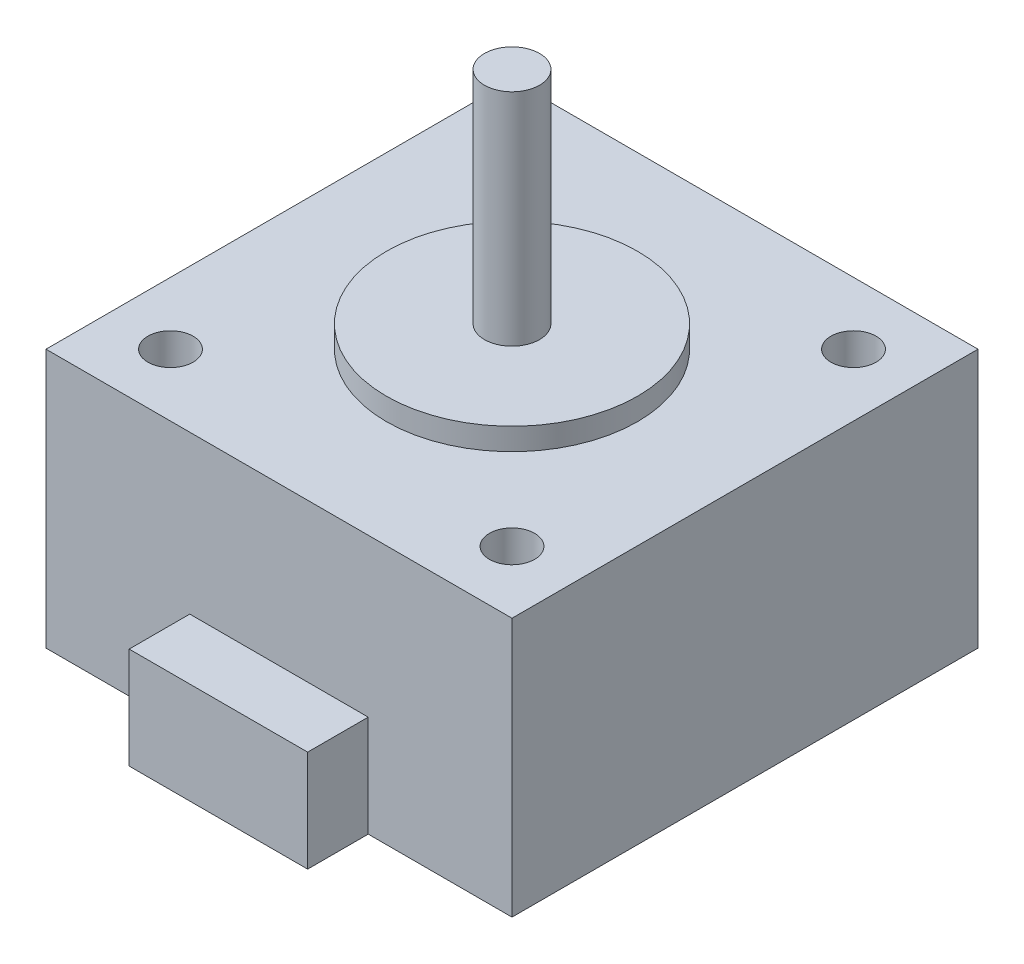
ISO-10303-21;
HEADER;
FILE_DESCRIPTION(('STEP AP214'),'2;1');
FILE_NAME('part.step','',(''),(''),'','','');
FILE_SCHEMA(('AUTOMOTIVE_DESIGN { 1 0 10303 214 1 1 1 1 }'));
ENDSEC;
DATA;
#1=APPLICATION_CONTEXT('core data for automotive mechanical design processes');
#2=APPLICATION_PROTOCOL_DEFINITION('international standard','automotive_design',2000,#1);
#3=PRODUCT_CONTEXT('',#1,'mechanical');
#4=PRODUCT('Part','Part','',(#3));
#5=PRODUCT_RELATED_PRODUCT_CATEGORY('part','',(#4));
#6=PRODUCT_DEFINITION_FORMATION('','',#4);
#7=PRODUCT_DEFINITION_CONTEXT('part definition',#1,'design');
#8=PRODUCT_DEFINITION('design','',#6,#7);
#9=PRODUCT_DEFINITION_SHAPE('','',#8);
#10=(LENGTH_UNIT() NAMED_UNIT(*) SI_UNIT(.MILLI.,.METRE.));
#11=(NAMED_UNIT(*) PLANE_ANGLE_UNIT() SI_UNIT($,.RADIAN.));
#12=(NAMED_UNIT(*) SI_UNIT($,.STERADIAN.) SOLID_ANGLE_UNIT());
#13=UNCERTAINTY_MEASURE_WITH_UNIT(LENGTH_MEASURE(1.E-05),#10,'distance_accuracy_value','');
#14=(GEOMETRIC_REPRESENTATION_CONTEXT(3) GLOBAL_UNCERTAINTY_ASSIGNED_CONTEXT((#13)) GLOBAL_UNIT_ASSIGNED_CONTEXT((#10,
#11,#12)) REPRESENTATION_CONTEXT('',''));
#15=CARTESIAN_POINT('',(0.,0.,0.));
#16=DIRECTION('',(0.,0.,1.));
#17=DIRECTION('',(1.,0.,0.));
#18=AXIS2_PLACEMENT_3D('',#15,#16,#17);
#19=CARTESIAN_POINT('',(0.,0.,0.));
#20=DIRECTION('',(0.,-1.,0.));
#21=DIRECTION('',(0.,0.,-1.));
#22=AXIS2_PLACEMENT_3D('',#19,#20,#21);
#23=PLANE('',#22);
#24=CARTESIAN_POINT('',(0.,0.,0.));
#25=DIRECTION('',(0.,-1.,0.));
#26=DIRECTION('',(0.,0.,-1.));
#27=AXIS2_PLACEMENT_3D('',#24,#25,#26);
#28=CIRCLE('',#27,11.4);
#29=CARTESIAN_POINT('',(0.,0.,-11.4));
#30=VERTEX_POINT('',#29);
#31=EDGE_CURVE('E11',#30,#30,#28,.F.);
#32=ORIENTED_EDGE('',*,*,#31,.F.);
#33=EDGE_LOOP('',(#32));
#34=FACE_BOUND('',#33,.T.);
#35=CARTESIAN_POINT('',(-15.5,0.,-15.5));
#36=DIRECTION('',(0.,1.,0.));
#37=DIRECTION('',(0.,0.,1.));
#38=AXIS2_PLACEMENT_3D('',#35,#36,#37);
#39=CIRCLE('',#38,2.05);
#40=CARTESIAN_POINT('',(-15.5,0.,-13.45));
#41=VERTEX_POINT('',#40);
#42=EDGE_CURVE('E148',#41,#41,#39,.T.);
#43=ORIENTED_EDGE('',*,*,#42,.F.);
#44=EDGE_LOOP('',(#43));
#45=FACE_BOUND('',#44,.T.);
#46=CARTESIAN_POINT('',(-15.5,0.,15.5));
#47=DIRECTION('',(0.,-1.,0.));
#48=DIRECTION('',(0.,0.,-1.));
#49=AXIS2_PLACEMENT_3D('',#46,#47,#48);
#50=CIRCLE('',#49,2.05);
#51=CARTESIAN_POINT('',(-15.5,0.,13.45));
#52=VERTEX_POINT('',#51);
#53=EDGE_CURVE('E141',#52,#52,#50,.T.);
#54=ORIENTED_EDGE('',*,*,#53,.T.);
#55=EDGE_LOOP('',(#54));
#56=FACE_BOUND('',#55,.T.);
#57=CARTESIAN_POINT('',(15.5,0.,-15.5));
#58=DIRECTION('',(0.,1.,0.));
#59=DIRECTION('',(0.,0.,1.));
#60=AXIS2_PLACEMENT_3D('',#57,#58,#59);
#61=CIRCLE('',#60,2.05);
#62=CARTESIAN_POINT('',(15.5,0.,-13.45));
#63=VERTEX_POINT('',#62);
#64=EDGE_CURVE('E144',#63,#63,#61,.F.);
#65=ORIENTED_EDGE('',*,*,#64,.T.);
#66=EDGE_LOOP('',(#65));
#67=FACE_BOUND('',#66,.T.);
#68=DIRECTION('',(0.,0.,-1.));
#69=VECTOR('',#68,1.);
#70=CARTESIAN_POINT('',(21.15,0.,21.15));
#71=LINE('',#70,#69);
#72=CARTESIAN_POINT('',(21.15,0.,21.15));
#73=VERTEX_POINT('',#72);
#74=CARTESIAN_POINT('',(21.15,0.,-21.15));
#75=VERTEX_POINT('',#74);
#76=EDGE_CURVE('E162',#73,#75,#71,.T.);
#77=ORIENTED_EDGE('',*,*,#76,.T.);
#78=DIRECTION('',(-1.,0.,0.));
#79=VECTOR('',#78,1.);
#80=CARTESIAN_POINT('',(-21.15,0.,-21.15));
#81=LINE('',#80,#79);
#82=CARTESIAN_POINT('',(-21.15,0.,-21.15));
#83=VERTEX_POINT('',#82);
#84=EDGE_CURVE('E181',#75,#83,#81,.T.);
#85=ORIENTED_EDGE('',*,*,#84,.T.);
#86=DIRECTION('',(0.,0.,1.));
#87=VECTOR('',#86,1.);
#88=CARTESIAN_POINT('',(-21.15,0.,21.15));
#89=LINE('',#88,#87);
#90=CARTESIAN_POINT('',(-21.15,0.,21.15));
#91=VERTEX_POINT('',#90);
#92=EDGE_CURVE('E184',#83,#91,#89,.T.);
#93=ORIENTED_EDGE('',*,*,#92,.T.);
#94=DIRECTION('',(1.,0.,0.));
#95=VECTOR('',#94,1.);
#96=CARTESIAN_POINT('',(-21.15,0.,21.15));
#97=LINE('',#96,#95);
#98=EDGE_CURVE('E169',#91,#73,#97,.T.);
#99=ORIENTED_EDGE('',*,*,#98,.T.);
#100=EDGE_LOOP('',(#77,#85,#93,#99));
#101=FACE_BOUND('',#100,.T.);
#102=CARTESIAN_POINT('',(15.5,0.,15.5));
#103=DIRECTION('',(0.,1.,0.));
#104=DIRECTION('',(0.,0.,1.));
#105=AXIS2_PLACEMENT_3D('',#102,#103,#104);
#106=CIRCLE('',#105,2.05);
#107=CARTESIAN_POINT('',(15.5,0.,17.55));
#108=VERTEX_POINT('',#107);
#109=EDGE_CURVE('E154',#108,#108,#106,.T.);
#110=ORIENTED_EDGE('',*,*,#109,.F.);
#111=EDGE_LOOP('',(#110));
#112=FACE_BOUND('',#111,.T.);
#113=ADVANCED_FACE('F43',(#34,#45,#56,#67,#101,#112),#23,.F.);
#114=CARTESIAN_POINT('',(21.15,-23.5,21.15));
#115=DIRECTION('',(1.,0.,0.));
#116=DIRECTION('',(0.,0.,-1.));
#117=AXIS2_PLACEMENT_3D('',#114,#115,#116);
#118=PLANE('',#117);
#119=ORIENTED_EDGE('',*,*,#76,.F.);
#120=DIRECTION('',(0.,1.,0.));
#121=VECTOR('',#120,1.);
#122=CARTESIAN_POINT('',(21.15,-23.5,21.15));
#123=LINE('',#122,#121);
#124=CARTESIAN_POINT('',(21.15,-23.5,21.15));
#125=VERTEX_POINT('',#124);
#126=EDGE_CURVE('E52',#125,#73,#123,.T.);
#127=ORIENTED_EDGE('',*,*,#126,.F.);
#128=DIRECTION('',(0.,0.,-1.));
#129=VECTOR('',#128,1.);
#130=CARTESIAN_POINT('',(21.15,-23.5,21.15));
#131=LINE('',#130,#129);
#132=CARTESIAN_POINT('',(21.15,-23.5,-21.15));
#133=VERTEX_POINT('',#132);
#134=EDGE_CURVE('E165',#125,#133,#131,.T.);
#135=ORIENTED_EDGE('',*,*,#134,.T.);
#136=DIRECTION('',(0.,1.,0.));
#137=VECTOR('',#136,1.);
#138=CARTESIAN_POINT('',(21.15,-23.5,-21.15));
#139=LINE('',#138,#137);
#140=EDGE_CURVE('E178',#133,#75,#139,.T.);
#141=ORIENTED_EDGE('',*,*,#140,.T.);
#142=EDGE_LOOP('',(#119,#127,#135,#141));
#143=FACE_BOUND('',#142,.T.);
#144=ADVANCED_FACE('F45',(#143),#118,.T.);
#145=CARTESIAN_POINT('',(-21.15,-23.5,21.15));
#146=DIRECTION('',(0.,0.,1.));
#147=DIRECTION('',(1.,0.,0.));
#148=AXIS2_PLACEMENT_3D('',#145,#146,#147);
#149=PLANE('',#148);
#150=DIRECTION('',(0.,1.,0.));
#151=VECTOR('',#150,1.);
#152=CARTESIAN_POINT('',(8.1,-23.5,21.15));
#153=LINE('',#152,#151);
#154=CARTESIAN_POINT('',(8.1,-23.5,21.15));
#155=VERTEX_POINT('',#154);
#156=CARTESIAN_POINT('',(8.1,-14.3,21.15));
#157=VERTEX_POINT('',#156);
#158=EDGE_CURVE('E64',#155,#157,#153,.T.);
#159=ORIENTED_EDGE('',*,*,#158,.F.);
#160=DIRECTION('',(1.,0.,0.));
#161=VECTOR('',#160,1.);
#162=CARTESIAN_POINT('',(-21.15,-23.5,21.15));
#163=LINE('',#162,#161);
#164=EDGE_CURVE('E175',#155,#125,#163,.T.);
#165=ORIENTED_EDGE('',*,*,#164,.T.);
#166=ORIENTED_EDGE('',*,*,#126,.T.);
#167=ORIENTED_EDGE('',*,*,#98,.F.);
#168=DIRECTION('',(0.,1.,0.));
#169=VECTOR('',#168,1.);
#170=CARTESIAN_POINT('',(-21.15,-23.5,21.15));
#171=LINE('',#170,#169);
#172=CARTESIAN_POINT('',(-21.15,-23.5,21.15));
#173=VERTEX_POINT('',#172);
#174=EDGE_CURVE('E190',#173,#91,#171,.T.);
#175=ORIENTED_EDGE('',*,*,#174,.F.);
#176=CARTESIAN_POINT('',(-8.1,-23.5,21.15));
#177=VERTEX_POINT('',#176);
#178=EDGE_CURVE('E176',#173,#177,#163,.T.);
#179=ORIENTED_EDGE('',*,*,#178,.T.);
#180=DIRECTION('',(0.,-1.,0.));
#181=VECTOR('',#180,1.);
#182=CARTESIAN_POINT('',(-8.1,-23.5,21.15));
#183=LINE('',#182,#181);
#184=CARTESIAN_POINT('',(-8.1,-14.3,21.15));
#185=VERTEX_POINT('',#184);
#186=EDGE_CURVE('E126',#185,#177,#183,.T.);
#187=ORIENTED_EDGE('',*,*,#186,.F.);
#188=DIRECTION('',(-1.,0.,0.));
#189=VECTOR('',#188,1.);
#190=CARTESIAN_POINT('',(-8.1,-14.3,21.15));
#191=LINE('',#190,#189);
#192=EDGE_CURVE('E59',#157,#185,#191,.T.);
#193=ORIENTED_EDGE('',*,*,#192,.F.);
#194=EDGE_LOOP('',(#159,#165,#166,#167,#175,#179,#187,#193));
#195=FACE_BOUND('',#194,.T.);
#196=ADVANCED_FACE('F206',(#195),#149,.T.);
#197=CARTESIAN_POINT('',(-21.15,-23.5,21.15));
#198=DIRECTION('',(-1.,0.,0.));
#199=DIRECTION('',(0.,0.,1.));
#200=AXIS2_PLACEMENT_3D('',#197,#198,#199);
#201=PLANE('',#200);
#202=ORIENTED_EDGE('',*,*,#92,.F.);
#203=DIRECTION('',(0.,1.,0.));
#204=VECTOR('',#203,1.);
#205=CARTESIAN_POINT('',(-21.15,-23.5,-21.15));
#206=LINE('',#205,#204);
#207=CARTESIAN_POINT('',(-21.15,-23.5,-21.15));
#208=VERTEX_POINT('',#207);
#209=EDGE_CURVE('E192',#208,#83,#206,.T.);
#210=ORIENTED_EDGE('',*,*,#209,.F.);
#211=DIRECTION('',(0.,0.,1.));
#212=VECTOR('',#211,1.);
#213=CARTESIAN_POINT('',(-21.15,-23.5,21.15));
#214=LINE('',#213,#212);
#215=EDGE_CURVE('E172',#208,#173,#214,.T.);
#216=ORIENTED_EDGE('',*,*,#215,.T.);
#217=ORIENTED_EDGE('',*,*,#174,.T.);
#218=EDGE_LOOP('',(#202,#210,#216,#217));
#219=FACE_BOUND('',#218,.T.);
#220=ADVANCED_FACE('F213',(#219),#201,.T.);
#221=CARTESIAN_POINT('',(-21.15,-23.5,-21.15));
#222=DIRECTION('',(0.,0.,-1.));
#223=DIRECTION('',(-1.,0.,0.));
#224=AXIS2_PLACEMENT_3D('',#221,#222,#223);
#225=PLANE('',#224);
#226=ORIENTED_EDGE('',*,*,#84,.F.);
#227=ORIENTED_EDGE('',*,*,#140,.F.);
#228=DIRECTION('',(-1.,0.,0.));
#229=VECTOR('',#228,1.);
#230=CARTESIAN_POINT('',(-21.15,-23.5,-21.15));
#231=LINE('',#230,#229);
#232=EDGE_CURVE('E168',#133,#208,#231,.T.);
#233=ORIENTED_EDGE('',*,*,#232,.T.);
#234=ORIENTED_EDGE('',*,*,#209,.T.);
#235=EDGE_LOOP('',(#226,#227,#233,#234));
#236=FACE_BOUND('',#235,.T.);
#237=ADVANCED_FACE('F201',(#236),#225,.T.);
#238=CARTESIAN_POINT('',(0.,-23.5,0.));
#239=DIRECTION('',(0.,-1.,0.));
#240=DIRECTION('',(0.,0.,-1.));
#241=AXIS2_PLACEMENT_3D('',#238,#239,#240);
#242=PLANE('',#241);
#243=ORIENTED_EDGE('',*,*,#134,.F.);
#244=ORIENTED_EDGE('',*,*,#164,.F.);
#245=DIRECTION('',(0.,0.,-1.));
#246=VECTOR('',#245,1.);
#247=CARTESIAN_POINT('',(8.1,-23.5,26.65));
#248=LINE('',#247,#246);
#249=CARTESIAN_POINT('',(8.1,-23.5,26.65));
#250=VERTEX_POINT('',#249);
#251=EDGE_CURVE('E426',#250,#155,#248,.T.);
#252=ORIENTED_EDGE('',*,*,#251,.F.);
#253=DIRECTION('',(1.,0.,0.));
#254=VECTOR('',#253,1.);
#255=CARTESIAN_POINT('',(-8.1,-23.5,26.65));
#256=LINE('',#255,#254);
#257=CARTESIAN_POINT('',(-8.1,-23.5,26.65));
#258=VERTEX_POINT('',#257);
#259=EDGE_CURVE('E122',#258,#250,#256,.T.);
#260=ORIENTED_EDGE('',*,*,#259,.F.);
#261=DIRECTION('',(0.,0.,-1.));
#262=VECTOR('',#261,1.);
#263=CARTESIAN_POINT('',(-8.1,-23.5,26.65));
#264=LINE('',#263,#262);
#265=EDGE_CURVE('E133',#258,#177,#264,.T.);
#266=ORIENTED_EDGE('',*,*,#265,.T.);
#267=ORIENTED_EDGE('',*,*,#178,.F.);
#268=ORIENTED_EDGE('',*,*,#215,.F.);
#269=ORIENTED_EDGE('',*,*,#232,.F.);
#270=EDGE_LOOP('',(#243,#244,#252,#260,#266,#267,#268,#269));
#271=FACE_BOUND('',#270,.T.);
#272=ADVANCED_FACE('F208',(#271),#242,.T.);
#273=CARTESIAN_POINT('',(15.5,-4.5,-15.5));
#274=DIRECTION('',(0.,1.,0.));
#275=DIRECTION('',(0.,0.,1.));
#276=AXIS2_PLACEMENT_3D('',#273,#274,#275);
#277=CYLINDRICAL_SURFACE('',#276,2.05);
#278=CARTESIAN_POINT('',(15.5,-4.5,-15.5));
#279=DIRECTION('',(0.,1.,0.));
#280=DIRECTION('',(0.,0.,1.));
#281=AXIS2_PLACEMENT_3D('',#278,#279,#280);
#282=CIRCLE('',#281,2.05);
#283=CARTESIAN_POINT('',(15.5,-4.5,-13.45));
#284=VERTEX_POINT('',#283);
#285=EDGE_CURVE('E159',#284,#284,#282,.F.);
#286=ORIENTED_EDGE('',*,*,#285,.T.);
#287=EDGE_LOOP('',(#286));
#288=FACE_BOUND('',#287,.T.);
#289=ORIENTED_EDGE('',*,*,#64,.F.);
#290=EDGE_LOOP('',(#289));
#291=FACE_BOUND('',#290,.T.);
#292=ADVANCED_FACE('F234',(#288,#291),#277,.F.);
#293=CARTESIAN_POINT('',(0.,-4.5,0.));
#294=DIRECTION('',(0.,1.,0.));
#295=DIRECTION('',(0.,0.,1.));
#296=AXIS2_PLACEMENT_3D('',#293,#294,#295);
#297=PLANE('',#296);
#298=ORIENTED_EDGE('',*,*,#285,.F.);
#299=EDGE_LOOP('',(#298));
#300=FACE_BOUND('',#299,.T.);
#301=ADVANCED_FACE('F237',(#300),#297,.T.);
#302=CARTESIAN_POINT('',(-15.5,-4.5,15.5));
#303=DIRECTION('',(0.,1.,0.));
#304=DIRECTION('',(0.,0.,1.));
#305=AXIS2_PLACEMENT_3D('',#302,#303,#304);
#306=CYLINDRICAL_SURFACE('',#305,2.05);
#307=CARTESIAN_POINT('',(-15.5,-4.5,15.5));
#308=DIRECTION('',(0.,-1.,0.));
#309=DIRECTION('',(0.,0.,-1.));
#310=AXIS2_PLACEMENT_3D('',#307,#308,#309);
#311=CIRCLE('',#310,2.05);
#312=CARTESIAN_POINT('',(-15.5,-4.5,13.45));
#313=VERTEX_POINT('',#312);
#314=EDGE_CURVE('E145',#313,#313,#311,.T.);
#315=ORIENTED_EDGE('',*,*,#314,.T.);
#316=EDGE_LOOP('',(#315));
#317=FACE_BOUND('',#316,.T.);
#318=ORIENTED_EDGE('',*,*,#53,.F.);
#319=EDGE_LOOP('',(#318));
#320=FACE_BOUND('',#319,.T.);
#321=ADVANCED_FACE('F241',(#317,#320),#306,.F.);
#322=CARTESIAN_POINT('',(-15.5,-4.5,15.5));
#323=DIRECTION('',(0.,-1.,0.));
#324=DIRECTION('',(0.,0.,-1.));
#325=AXIS2_PLACEMENT_3D('',#322,#323,#324);
#326=PLANE('',#325);
#327=ORIENTED_EDGE('',*,*,#314,.F.);
#328=EDGE_LOOP('',(#327));
#329=FACE_BOUND('',#328,.T.);
#330=ADVANCED_FACE('F258',(#329),#326,.F.);
#331=CARTESIAN_POINT('',(-15.5,-4.5,-15.5));
#332=DIRECTION('',(0.,1.,0.));
#333=DIRECTION('',(0.,0.,1.));
#334=AXIS2_PLACEMENT_3D('',#331,#332,#333);
#335=CYLINDRICAL_SURFACE('',#334,2.05);
#336=CARTESIAN_POINT('',(-15.5,-4.5,-15.5));
#337=DIRECTION('',(0.,1.,0.));
#338=DIRECTION('',(0.,0.,1.));
#339=AXIS2_PLACEMENT_3D('',#336,#337,#338);
#340=CIRCLE('',#339,2.05);
#341=CARTESIAN_POINT('',(-15.5,-4.5,-13.45));
#342=VERTEX_POINT('',#341);
#343=EDGE_CURVE('E151',#342,#342,#340,.T.);
#344=ORIENTED_EDGE('',*,*,#343,.F.);
#345=EDGE_LOOP('',(#344));
#346=FACE_BOUND('',#345,.T.);
#347=ORIENTED_EDGE('',*,*,#42,.T.);
#348=EDGE_LOOP('',(#347));
#349=FACE_BOUND('',#348,.T.);
#350=ADVANCED_FACE('F254',(#346,#349),#335,.F.);
#351=CARTESIAN_POINT('',(-15.5,-4.5,-15.5));
#352=DIRECTION('',(0.,1.,0.));
#353=DIRECTION('',(0.,0.,1.));
#354=AXIS2_PLACEMENT_3D('',#351,#352,#353);
#355=PLANE('',#354);
#356=ORIENTED_EDGE('',*,*,#343,.T.);
#357=EDGE_LOOP('',(#356));
#358=FACE_BOUND('',#357,.T.);
#359=ADVANCED_FACE('F250',(#358),#355,.T.);
#360=CARTESIAN_POINT('',(15.5,-4.5,15.5));
#361=DIRECTION('',(0.,1.,0.));
#362=DIRECTION('',(0.,0.,1.));
#363=AXIS2_PLACEMENT_3D('',#360,#361,#362);
#364=CYLINDRICAL_SURFACE('',#363,2.05);
#365=CARTESIAN_POINT('',(15.5,-4.5,15.5));
#366=DIRECTION('',(0.,1.,0.));
#367=DIRECTION('',(0.,0.,1.));
#368=AXIS2_PLACEMENT_3D('',#365,#366,#367);
#369=CIRCLE('',#368,2.05);
#370=CARTESIAN_POINT('',(15.5,-4.5,17.55));
#371=VERTEX_POINT('',#370);
#372=EDGE_CURVE('E140',#371,#371,#369,.T.);
#373=ORIENTED_EDGE('',*,*,#372,.F.);
#374=EDGE_LOOP('',(#373));
#375=FACE_BOUND('',#374,.T.);
#376=ORIENTED_EDGE('',*,*,#109,.T.);
#377=EDGE_LOOP('',(#376));
#378=FACE_BOUND('',#377,.T.);
#379=ADVANCED_FACE('F246',(#375,#378),#364,.F.);
#380=CARTESIAN_POINT('',(15.5,-4.5,15.5));
#381=DIRECTION('',(0.,1.,0.));
#382=DIRECTION('',(0.,0.,1.));
#383=AXIS2_PLACEMENT_3D('',#380,#381,#382);
#384=PLANE('',#383);
#385=ORIENTED_EDGE('',*,*,#372,.T.);
#386=EDGE_LOOP('',(#385));
#387=FACE_BOUND('',#386,.T.);
#388=ADVANCED_FACE('F243',(#387),#384,.T.);
#389=CARTESIAN_POINT('',(0.,2.,0.));
#390=DIRECTION('',(0.,-1.,0.));
#391=DIRECTION('',(0.,0.,-1.));
#392=AXIS2_PLACEMENT_3D('',#389,#390,#391);
#393=CYLINDRICAL_SURFACE('',#392,11.4);
#394=CARTESIAN_POINT('',(0.,2.,0.));
#395=DIRECTION('',(0.,1.,0.));
#396=DIRECTION('',(0.,0.,1.));
#397=AXIS2_PLACEMENT_3D('',#394,#395,#396);
#398=CIRCLE('',#397,11.4);
#399=CARTESIAN_POINT('',(0.,2.,11.4));
#400=VERTEX_POINT('',#399);
#401=EDGE_CURVE('E137',#400,#400,#398,.T.);
#402=ORIENTED_EDGE('',*,*,#401,.F.);
#403=EDGE_LOOP('',(#402));
#404=FACE_BOUND('',#403,.T.);
#405=ORIENTED_EDGE('',*,*,#31,.T.);
#406=EDGE_LOOP('',(#405));
#407=FACE_BOUND('',#406,.T.);
#408=ADVANCED_FACE('F245',(#404,#407),#393,.T.);
#409=CARTESIAN_POINT('',(0.,2.,0.));
#410=DIRECTION('',(0.,1.,0.));
#411=DIRECTION('',(0.,0.,1.));
#412=AXIS2_PLACEMENT_3D('',#409,#410,#411);
#413=PLANE('',#412);
#414=CARTESIAN_POINT('',(0.,2.,0.));
#415=DIRECTION('',(0.,1.,0.));
#416=DIRECTION('',(0.,0.,1.));
#417=AXIS2_PLACEMENT_3D('',#414,#415,#416);
#418=CIRCLE('',#417,2.5);
#419=CARTESIAN_POINT('',(0.,2.,2.5));
#420=VERTEX_POINT('',#419);
#421=EDGE_CURVE('E47',#420,#420,#418,.F.);
#422=ORIENTED_EDGE('',*,*,#421,.T.);
#423=EDGE_LOOP('',(#422));
#424=FACE_BOUND('',#423,.T.);
#425=ORIENTED_EDGE('',*,*,#401,.T.);
#426=EDGE_LOOP('',(#425));
#427=FACE_BOUND('',#426,.T.);
#428=ADVANCED_FACE('F267',(#424,#427),#413,.T.);
#429=CARTESIAN_POINT('',(0.,22.,0.));
#430=DIRECTION('',(0.,-1.,0.));
#431=DIRECTION('',(0.,0.,-1.));
#432=AXIS2_PLACEMENT_3D('',#429,#430,#431);
#433=CYLINDRICAL_SURFACE('',#432,2.5);
#434=ORIENTED_EDGE('',*,*,#421,.F.);
#435=EDGE_LOOP('',(#434));
#436=FACE_BOUND('',#435,.T.);
#437=CARTESIAN_POINT('',(0.,22.,0.));
#438=DIRECTION('',(0.,1.,0.));
#439=DIRECTION('',(0.,0.,1.));
#440=AXIS2_PLACEMENT_3D('',#437,#438,#439);
#441=CIRCLE('',#440,2.5);
#442=CARTESIAN_POINT('',(0.,22.,2.5));
#443=VERTEX_POINT('',#442);
#444=EDGE_CURVE('E129',#443,#443,#441,.T.);
#445=ORIENTED_EDGE('',*,*,#444,.F.);
#446=EDGE_LOOP('',(#445));
#447=FACE_BOUND('',#446,.T.);
#448=ADVANCED_FACE('F271',(#436,#447),#433,.T.);
#449=CARTESIAN_POINT('',(0.,22.,0.));
#450=DIRECTION('',(0.,1.,0.));
#451=DIRECTION('',(0.,0.,1.));
#452=AXIS2_PLACEMENT_3D('',#449,#450,#451);
#453=PLANE('',#452);
#454=ORIENTED_EDGE('',*,*,#444,.T.);
#455=EDGE_LOOP('',(#454));
#456=FACE_BOUND('',#455,.T.);
#457=ADVANCED_FACE('F275',(#456),#453,.T.);
#458=CARTESIAN_POINT('',(8.1,-23.5,26.65));
#459=DIRECTION('',(-1.,0.,0.));
#460=DIRECTION('',(0.,0.,1.));
#461=AXIS2_PLACEMENT_3D('',#458,#459,#460);
#462=PLANE('',#461);
#463=ORIENTED_EDGE('',*,*,#158,.T.);
#464=DIRECTION('',(0.,0.,-1.));
#465=VECTOR('',#464,1.);
#466=CARTESIAN_POINT('',(8.1,-14.3,26.65));
#467=LINE('',#466,#465);
#468=CARTESIAN_POINT('',(8.1,-14.3,26.65));
#469=VERTEX_POINT('',#468);
#470=EDGE_CURVE('E111',#469,#157,#467,.T.);
#471=ORIENTED_EDGE('',*,*,#470,.F.);
#472=DIRECTION('',(0.,1.,0.));
#473=VECTOR('',#472,1.);
#474=CARTESIAN_POINT('',(8.1,-23.5,26.65));
#475=LINE('',#474,#473);
#476=EDGE_CURVE('E117',#250,#469,#475,.T.);
#477=ORIENTED_EDGE('',*,*,#476,.F.);
#478=ORIENTED_EDGE('',*,*,#251,.T.);
#479=EDGE_LOOP('',(#463,#471,#477,#478));
#480=FACE_BOUND('',#479,.T.);
#481=ADVANCED_FACE('F128',(#480),#462,.F.);
#482=CARTESIAN_POINT('',(-8.1,-14.3,26.65));
#483=DIRECTION('',(0.,-1.,0.));
#484=DIRECTION('',(0.,0.,-1.));
#485=AXIS2_PLACEMENT_3D('',#482,#483,#484);
#486=PLANE('',#485);
#487=ORIENTED_EDGE('',*,*,#192,.T.);
#488=DIRECTION('',(0.,0.,-1.));
#489=VECTOR('',#488,1.);
#490=CARTESIAN_POINT('',(-8.1,-14.3,26.65));
#491=LINE('',#490,#489);
#492=CARTESIAN_POINT('',(-8.1,-14.3,26.65));
#493=VERTEX_POINT('',#492);
#494=EDGE_CURVE('E113',#493,#185,#491,.T.);
#495=ORIENTED_EDGE('',*,*,#494,.F.);
#496=DIRECTION('',(-1.,0.,0.));
#497=VECTOR('',#496,1.);
#498=CARTESIAN_POINT('',(-8.1,-14.3,26.65));
#499=LINE('',#498,#497);
#500=EDGE_CURVE('E107',#469,#493,#499,.T.);
#501=ORIENTED_EDGE('',*,*,#500,.F.);
#502=ORIENTED_EDGE('',*,*,#470,.T.);
#503=EDGE_LOOP('',(#487,#495,#501,#502));
#504=FACE_BOUND('',#503,.T.);
#505=ADVANCED_FACE('F109',(#504),#486,.F.);
#506=CARTESIAN_POINT('',(-8.1,-23.5,26.65));
#507=DIRECTION('',(1.,0.,0.));
#508=DIRECTION('',(0.,0.,-1.));
#509=AXIS2_PLACEMENT_3D('',#506,#507,#508);
#510=PLANE('',#509);
#511=ORIENTED_EDGE('',*,*,#186,.T.);
#512=ORIENTED_EDGE('',*,*,#265,.F.);
#513=DIRECTION('',(0.,-1.,0.));
#514=VECTOR('',#513,1.);
#515=CARTESIAN_POINT('',(-8.1,-23.5,26.65));
#516=LINE('',#515,#514);
#517=EDGE_CURVE('E116',#493,#258,#516,.T.);
#518=ORIENTED_EDGE('',*,*,#517,.F.);
#519=ORIENTED_EDGE('',*,*,#494,.T.);
#520=EDGE_LOOP('',(#511,#512,#518,#519));
#521=FACE_BOUND('',#520,.T.);
#522=ADVANCED_FACE('F284',(#521),#510,.F.);
#523=CARTESIAN_POINT('',(0.,0.,26.65));
#524=DIRECTION('',(0.,0.,-1.));
#525=DIRECTION('',(-1.,0.,0.));
#526=AXIS2_PLACEMENT_3D('',#523,#524,#525);
#527=PLANE('',#526);
#528=ORIENTED_EDGE('',*,*,#476,.T.);
#529=ORIENTED_EDGE('',*,*,#500,.T.);
#530=ORIENTED_EDGE('',*,*,#517,.T.);
#531=ORIENTED_EDGE('',*,*,#259,.T.);
#532=EDGE_LOOP('',(#528,#529,#530,#531));
#533=FACE_BOUND('',#532,.T.);
#534=ADVANCED_FACE('F120',(#533),#527,.F.);
#535=CLOSED_SHELL('',(#113,#144,#196,#220,#237,#272,#292,#301,#321,#330,#350,#359,#379,#388,
#408,#428,#448,#457,#481,#505,#522,#534));
#536=MANIFOLD_SOLID_BREP('B2',#535);
#537=ADVANCED_BREP_SHAPE_REPRESENTATION('',(#18,#536),#14);
#538=SHAPE_DEFINITION_REPRESENTATION(#9,#537);
ENDSEC;
END-ISO-10303-21;
